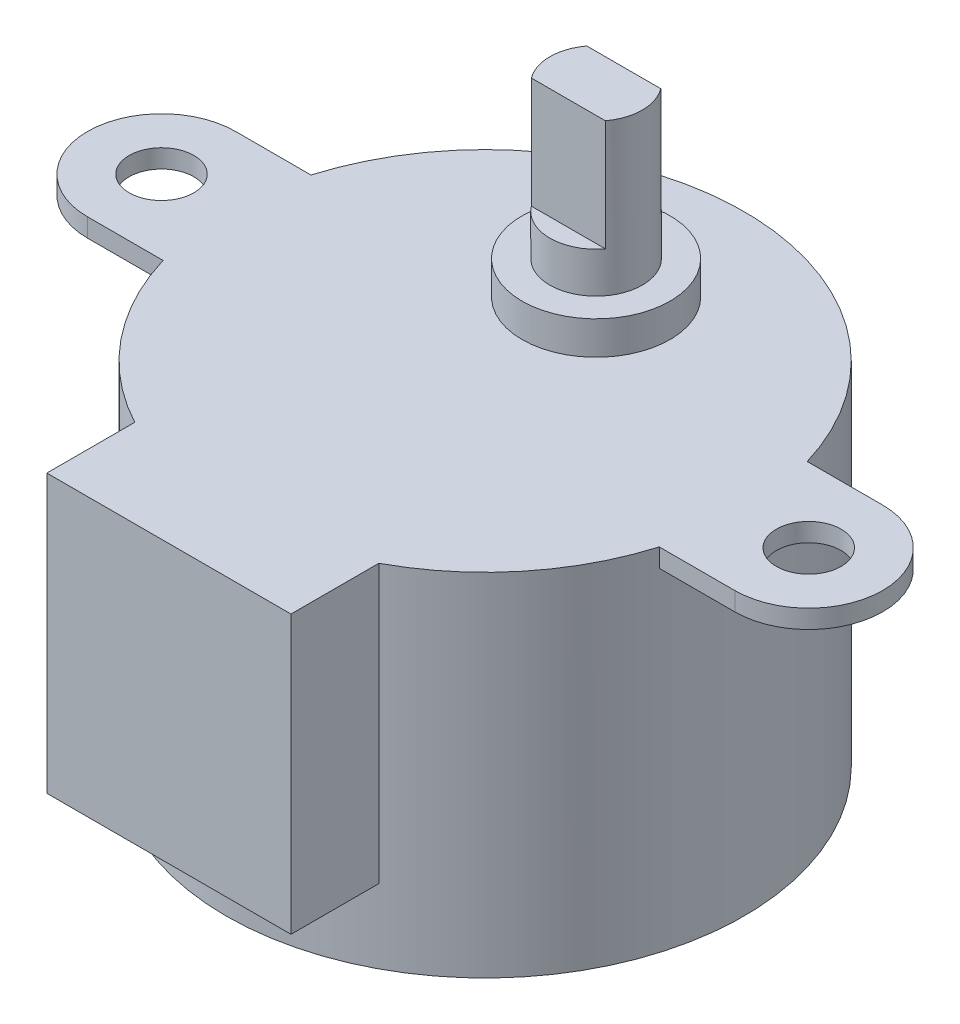
ISO-10303-21;
HEADER;
FILE_DESCRIPTION(('STEP AP214'),'2;1');
FILE_NAME('part.step','',(''),(''),'','','');
FILE_SCHEMA(('AUTOMOTIVE_DESIGN { 1 0 10303 214 1 1 1 1 }'));
ENDSEC;
DATA;
#1=APPLICATION_CONTEXT('core data for automotive mechanical design processes');
#2=APPLICATION_PROTOCOL_DEFINITION('international standard','automotive_design',2000,#1);
#3=PRODUCT_CONTEXT('',#1,'mechanical');
#4=PRODUCT('Part','Part','',(#3));
#5=PRODUCT_RELATED_PRODUCT_CATEGORY('part','',(#4));
#6=PRODUCT_DEFINITION_FORMATION('','',#4);
#7=PRODUCT_DEFINITION_CONTEXT('part definition',#1,'design');
#8=PRODUCT_DEFINITION('design','',#6,#7);
#9=PRODUCT_DEFINITION_SHAPE('','',#8);
#10=(LENGTH_UNIT() NAMED_UNIT(*) SI_UNIT(.MILLI.,.METRE.));
#11=(NAMED_UNIT(*) PLANE_ANGLE_UNIT() SI_UNIT($,.RADIAN.));
#12=(NAMED_UNIT(*) SI_UNIT($,.STERADIAN.) SOLID_ANGLE_UNIT());
#13=UNCERTAINTY_MEASURE_WITH_UNIT(LENGTH_MEASURE(1.E-05),#10,'distance_accuracy_value','');
#14=(GEOMETRIC_REPRESENTATION_CONTEXT(3) GLOBAL_UNCERTAINTY_ASSIGNED_CONTEXT((#13)) GLOBAL_UNIT_ASSIGNED_CONTEXT((#10,
#11,#12)) REPRESENTATION_CONTEXT('',''));
#15=CARTESIAN_POINT('',(0.,0.,0.));
#16=DIRECTION('',(0.,0.,1.));
#17=DIRECTION('',(1.,0.,0.));
#18=AXIS2_PLACEMENT_3D('',#15,#16,#17);
#19=CARTESIAN_POINT('',(0.,29.,-6.));
#20=DIRECTION('',(0.,-1.,0.));
#21=DIRECTION('',(0.,0.,-1.));
#22=AXIS2_PLACEMENT_3D('',#19,#20,#21);
#23=CYLINDRICAL_SURFACE('',#22,2.5);
#24=CARTESIAN_POINT('',(0.,29.,-6.));
#25=DIRECTION('',(0.,1.,0.));
#26=DIRECTION('',(0.,0.,1.));
#27=AXIS2_PLACEMENT_3D('',#24,#25,#26);
#28=CIRCLE('',#27,2.5);
#29=CARTESIAN_POINT('',(2.,29.,-4.5));
#30=VERTEX_POINT('',#29);
#31=CARTESIAN_POINT('',(2.,29.,-7.5));
#32=VERTEX_POINT('',#31);
#33=EDGE_CURVE('E172',#30,#32,#28,.T.);
#34=ORIENTED_EDGE('',*,*,#33,.F.);
#35=DIRECTION('',(0.,1.,0.));
#36=VECTOR('',#35,1.);
#37=CARTESIAN_POINT('',(2.,23.,-4.5));
#38=LINE('',#37,#36);
#39=CARTESIAN_POINT('',(2.,23.,-4.5));
#40=VERTEX_POINT('',#39);
#41=EDGE_CURVE('E65',#40,#30,#38,.T.);
#42=ORIENTED_EDGE('',*,*,#41,.F.);
#43=CARTESIAN_POINT('',(0.,23.,-6.));
#44=DIRECTION('',(0.,1.,0.));
#45=DIRECTION('',(0.,0.,1.));
#46=AXIS2_PLACEMENT_3D('',#43,#44,#45);
#47=CIRCLE('',#46,2.5);
#48=CARTESIAN_POINT('',(-2.,23.,-4.5));
#49=VERTEX_POINT('',#48);
#50=EDGE_CURVE('E156',#49,#40,#47,.T.);
#51=ORIENTED_EDGE('',*,*,#50,.F.);
#52=DIRECTION('',(0.,1.,0.));
#53=VECTOR('',#52,1.);
#54=CARTESIAN_POINT('',(-2.,23.,-4.5));
#55=LINE('',#54,#53);
#56=CARTESIAN_POINT('',(-2.,29.,-4.5));
#57=VERTEX_POINT('',#56);
#58=EDGE_CURVE('E165',#49,#57,#55,.T.);
#59=ORIENTED_EDGE('',*,*,#58,.T.);
#60=CARTESIAN_POINT('',(-2.,29.,-7.5));
#61=VERTEX_POINT('',#60);
#62=EDGE_CURVE('E176',#61,#57,#28,.T.);
#63=ORIENTED_EDGE('',*,*,#62,.F.);
#64=DIRECTION('',(0.,1.,0.));
#65=VECTOR('',#64,1.);
#66=CARTESIAN_POINT('',(-2.,23.,-7.5));
#67=LINE('',#66,#65);
#68=CARTESIAN_POINT('',(-2.,23.,-7.5));
#69=VERTEX_POINT('',#68);
#70=EDGE_CURVE('E57',#69,#61,#67,.T.);
#71=ORIENTED_EDGE('',*,*,#70,.F.);
#72=CARTESIAN_POINT('',(0.,23.,-6.));
#73=DIRECTION('',(0.,1.,0.));
#74=DIRECTION('',(0.,0.,1.));
#75=AXIS2_PLACEMENT_3D('',#72,#73,#74);
#76=CIRCLE('',#75,2.5);
#77=CARTESIAN_POINT('',(2.,23.,-7.5));
#78=VERTEX_POINT('',#77);
#79=EDGE_CURVE('E183',#78,#69,#76,.T.);
#80=ORIENTED_EDGE('',*,*,#79,.F.);
#81=DIRECTION('',(0.,1.,0.));
#82=VECTOR('',#81,1.);
#83=CARTESIAN_POINT('',(2.,23.,-7.5));
#84=LINE('',#83,#82);
#85=EDGE_CURVE('E188',#78,#32,#84,.T.);
#86=ORIENTED_EDGE('',*,*,#85,.T.);
#87=EDGE_LOOP('',(#34,#42,#51,#59,#63,#71,#80,#86));
#88=FACE_BOUND('',#87,.T.);
#89=CARTESIAN_POINT('',(0.,20.8,-6.));
#90=DIRECTION('',(0.,1.,0.));
#91=DIRECTION('',(0.,0.,1.));
#92=AXIS2_PLACEMENT_3D('',#89,#90,#91);
#93=CIRCLE('',#92,2.5);
#94=CARTESIAN_POINT('',(0.,20.8,-3.5));
#95=VERTEX_POINT('',#94);
#96=EDGE_CURVE('E11',#95,#95,#93,.T.);
#97=ORIENTED_EDGE('',*,*,#96,.T.);
#98=EDGE_LOOP('',(#97));
#99=FACE_BOUND('',#98,.T.);
#100=ADVANCED_FACE('F39',(#88,#99),#23,.T.);
#101=CARTESIAN_POINT('',(0.,29.,-6.));
#102=DIRECTION('',(0.,1.,0.));
#103=DIRECTION('',(0.,0.,1.));
#104=AXIS2_PLACEMENT_3D('',#101,#102,#103);
#105=PLANE('',#104);
#106=DIRECTION('',(-1.,0.,0.));
#107=VECTOR('',#106,1.);
#108=CARTESIAN_POINT('',(0.,29.,-4.5));
#109=LINE('',#108,#107);
#110=EDGE_CURVE('E162',#30,#57,#109,.T.);
#111=ORIENTED_EDGE('',*,*,#110,.F.);
#112=ORIENTED_EDGE('',*,*,#33,.T.);
#113=DIRECTION('',(-1.,0.,0.));
#114=VECTOR('',#113,1.);
#115=CARTESIAN_POINT('',(0.,29.,-7.5));
#116=LINE('',#115,#114);
#117=EDGE_CURVE('E184',#32,#61,#116,.T.);
#118=ORIENTED_EDGE('',*,*,#117,.T.);
#119=ORIENTED_EDGE('',*,*,#62,.T.);
#120=EDGE_LOOP('',(#111,#112,#118,#119));
#121=FACE_BOUND('',#120,.T.);
#122=ADVANCED_FACE('F399',(#121),#105,.T.);
#123=CARTESIAN_POINT('',(0.,19.,0.));
#124=DIRECTION('',(0.,-1.,0.));
#125=DIRECTION('',(0.,0.,-1.));
#126=AXIS2_PLACEMENT_3D('',#123,#124,#125);
#127=CYLINDRICAL_SURFACE('',#126,14.);
#128=CARTESIAN_POINT('',(0.,18.,0.));
#129=DIRECTION('',(0.,1.,0.));
#130=DIRECTION('',(0.,0.,1.));
#131=AXIS2_PLACEMENT_3D('',#128,#129,#130);
#132=CIRCLE('',#131,14.);
#133=CARTESIAN_POINT('',(13.4164078649987,18.,4.));
#134=VERTEX_POINT('',#133);
#135=CARTESIAN_POINT('',(13.4164078649987,18.,-4.00000000000001));
#136=VERTEX_POINT('',#135);
#137=EDGE_CURVE('E49',#134,#136,#132,.T.);
#138=ORIENTED_EDGE('',*,*,#137,.F.);
#139=DIRECTION('',(0.,-1.,0.));
#140=VECTOR('',#139,1.);
#141=CARTESIAN_POINT('',(13.4164078649987,19.,4.));
#142=LINE('',#141,#140);
#143=CARTESIAN_POINT('',(13.4164078649987,19.,4.));
#144=VERTEX_POINT('',#143);
#145=EDGE_CURVE('E277',#134,#144,#142,.F.);
#146=ORIENTED_EDGE('',*,*,#145,.T.);
#147=CARTESIAN_POINT('',(0.,19.,0.));
#148=DIRECTION('',(0.,1.,0.));
#149=DIRECTION('',(0.,0.,1.));
#150=AXIS2_PLACEMENT_3D('',#147,#148,#149);
#151=CIRCLE('',#150,14.);
#152=CARTESIAN_POINT('',(6.60138016649946,19.,12.3459215896322));
#153=VERTEX_POINT('',#152);
#154=EDGE_CURVE('E322',#153,#144,#151,.T.);
#155=ORIENTED_EDGE('',*,*,#154,.F.);
#156=DIRECTION('',(0.,-1.,0.));
#157=VECTOR('',#156,1.);
#158=CARTESIAN_POINT('',(6.60138016649946,19.,12.3459215896322));
#159=LINE('',#158,#157);
#160=CARTESIAN_POINT('',(6.60138016649946,4.,12.3459215896322));
#161=VERTEX_POINT('',#160);
#162=EDGE_CURVE('E310',#153,#161,#159,.T.);
#163=ORIENTED_EDGE('',*,*,#162,.T.);
#164=CARTESIAN_POINT('',(0.,4.,0.));
#165=DIRECTION('',(0.,1.,0.));
#166=DIRECTION('',(0.,0.,1.));
#167=AXIS2_PLACEMENT_3D('',#164,#165,#166);
#168=CIRCLE('',#167,14.);
#169=CARTESIAN_POINT('',(-6.60138016649946,4.,12.3459215896322));
#170=VERTEX_POINT('',#169);
#171=EDGE_CURVE('E326',#170,#161,#168,.T.);
#172=ORIENTED_EDGE('',*,*,#171,.F.);
#173=DIRECTION('',(0.,-1.,0.));
#174=VECTOR('',#173,1.);
#175=CARTESIAN_POINT('',(-6.60138016649946,19.,12.3459215896322));
#176=LINE('',#175,#174);
#177=CARTESIAN_POINT('',(-6.60138016649946,19.,12.3459215896322));
#178=VERTEX_POINT('',#177);
#179=EDGE_CURVE('E317',#170,#178,#176,.F.);
#180=ORIENTED_EDGE('',*,*,#179,.T.);
#181=CARTESIAN_POINT('',(-13.4164078649987,19.,4.));
#182=VERTEX_POINT('',#181);
#183=EDGE_CURVE('E328',#182,#178,#151,.T.);
#184=ORIENTED_EDGE('',*,*,#183,.F.);
#185=DIRECTION('',(0.,-1.,0.));
#186=VECTOR('',#185,1.);
#187=CARTESIAN_POINT('',(-13.4164078649987,19.,4.));
#188=LINE('',#187,#186);
#189=CARTESIAN_POINT('',(-13.4164078649987,18.,4.));
#190=VERTEX_POINT('',#189);
#191=EDGE_CURVE('E281',#182,#190,#188,.T.);
#192=ORIENTED_EDGE('',*,*,#191,.T.);
#193=CARTESIAN_POINT('',(-13.4164078649987,18.,-4.));
#194=VERTEX_POINT('',#193);
#195=EDGE_CURVE('E43',#194,#190,#132,.T.);
#196=ORIENTED_EDGE('',*,*,#195,.F.);
#197=DIRECTION('',(0.,-1.,0.));
#198=VECTOR('',#197,1.);
#199=CARTESIAN_POINT('',(-13.4164078649987,19.,-4.));
#200=LINE('',#199,#198);
#201=CARTESIAN_POINT('',(-13.4164078649987,19.,-4.));
#202=VERTEX_POINT('',#201);
#203=EDGE_CURVE('E260',#194,#202,#200,.F.);
#204=ORIENTED_EDGE('',*,*,#203,.T.);
#205=CARTESIAN_POINT('',(13.4164078649987,19.,-4.00000000000001));
#206=VERTEX_POINT('',#205);
#207=EDGE_CURVE('E327',#206,#202,#151,.T.);
#208=ORIENTED_EDGE('',*,*,#207,.F.);
#209=DIRECTION('',(0.,-1.,0.));
#210=VECTOR('',#209,1.);
#211=CARTESIAN_POINT('',(13.4164078649987,19.,-4.00000000000001));
#212=LINE('',#211,#210);
#213=EDGE_CURVE('E273',#206,#136,#212,.T.);
#214=ORIENTED_EDGE('',*,*,#213,.T.);
#215=EDGE_LOOP('',(#138,#146,#155,#163,#172,#180,#184,#192,#196,#204,#208,#214));
#216=FACE_BOUND('',#215,.T.);
#217=CARTESIAN_POINT('',(0.,0.,0.));
#218=DIRECTION('',(0.,1.,0.));
#219=DIRECTION('',(0.,0.,1.));
#220=AXIS2_PLACEMENT_3D('',#217,#218,#219);
#221=CIRCLE('',#220,14.);
#222=CARTESIAN_POINT('',(0.,0.,14.));
#223=VERTEX_POINT('',#222);
#224=EDGE_CURVE('E321',#223,#223,#221,.T.);
#225=ORIENTED_EDGE('',*,*,#224,.T.);
#226=EDGE_LOOP('',(#225));
#227=FACE_BOUND('',#226,.T.);
#228=ADVANCED_FACE('F41',(#216,#227),#127,.T.);
#229=CARTESIAN_POINT('',(0.,19.,0.));
#230=DIRECTION('',(0.,1.,0.));
#231=DIRECTION('',(0.,0.,1.));
#232=AXIS2_PLACEMENT_3D('',#229,#230,#231);
#233=PLANE('',#232);
#234=CARTESIAN_POINT('',(0.,19.,-6.));
#235=DIRECTION('',(0.,1.,0.));
#236=DIRECTION('',(0.,0.,1.));
#237=AXIS2_PLACEMENT_3D('',#234,#235,#236);
#238=CIRCLE('',#237,4.);
#239=CARTESIAN_POINT('',(0.,19.,-2.));
#240=VERTEX_POINT('',#239);
#241=EDGE_CURVE('E196',#240,#240,#238,.T.);
#242=ORIENTED_EDGE('',*,*,#241,.F.);
#243=EDGE_LOOP('',(#242));
#244=FACE_BOUND('',#243,.T.);
#245=ORIENTED_EDGE('',*,*,#207,.T.);
#246=DIRECTION('',(-1.,0.,0.));
#247=VECTOR('',#246,1.);
#248=CARTESIAN_POINT('',(17.5,19.,-4.00000000000001));
#249=LINE('',#248,#247);
#250=CARTESIAN_POINT('',(-17.5,19.,-4.));
#251=VERTEX_POINT('',#250);
#252=EDGE_CURVE('E245',#202,#251,#249,.T.);
#253=ORIENTED_EDGE('',*,*,#252,.T.);
#254=CARTESIAN_POINT('',(-17.5,19.,0.));
#255=DIRECTION('',(0.,1.,0.));
#256=DIRECTION('',(0.,0.,1.));
#257=AXIS2_PLACEMENT_3D('',#254,#255,#256);
#258=CIRCLE('',#257,4.);
#259=CARTESIAN_POINT('',(-17.5,19.,4.00000000000001));
#260=VERTEX_POINT('',#259);
#261=EDGE_CURVE('E249',#251,#260,#258,.T.);
#262=ORIENTED_EDGE('',*,*,#261,.T.);
#263=DIRECTION('',(1.,0.,0.));
#264=VECTOR('',#263,1.);
#265=CARTESIAN_POINT('',(17.5,19.,3.99999999999999));
#266=LINE('',#265,#264);
#267=EDGE_CURVE('E227',#260,#182,#266,.T.);
#268=ORIENTED_EDGE('',*,*,#267,.T.);
#269=ORIENTED_EDGE('',*,*,#183,.T.);
#270=DIRECTION('',(0.,0.,1.));
#271=VECTOR('',#270,1.);
#272=CARTESIAN_POINT('',(-6.60138016649946,19.,17.1));
#273=LINE('',#272,#271);
#274=CARTESIAN_POINT('',(-6.60138016649946,19.,17.1));
#275=VERTEX_POINT('',#274);
#276=EDGE_CURVE('E285',#178,#275,#273,.T.);
#277=ORIENTED_EDGE('',*,*,#276,.T.);
#278=DIRECTION('',(1.,0.,0.));
#279=VECTOR('',#278,1.);
#280=CARTESIAN_POINT('',(6.60138016649946,19.,17.1));
#281=LINE('',#280,#279);
#282=CARTESIAN_POINT('',(6.60138016649946,19.,17.1));
#283=VERTEX_POINT('',#282);
#284=EDGE_CURVE('E301',#275,#283,#281,.T.);
#285=ORIENTED_EDGE('',*,*,#284,.T.);
#286=DIRECTION('',(0.,0.,-1.));
#287=VECTOR('',#286,1.);
#288=CARTESIAN_POINT('',(6.60138016649946,19.,17.1));
#289=LINE('',#288,#287);
#290=EDGE_CURVE('E290',#283,#153,#289,.T.);
#291=ORIENTED_EDGE('',*,*,#290,.T.);
#292=ORIENTED_EDGE('',*,*,#154,.T.);
#293=CARTESIAN_POINT('',(17.5,19.,3.99999999999999));
#294=VERTEX_POINT('',#293);
#295=EDGE_CURVE('E253',#144,#294,#266,.T.);
#296=ORIENTED_EDGE('',*,*,#295,.T.);
#297=CARTESIAN_POINT('',(17.5,19.,0.));
#298=DIRECTION('',(0.,1.,0.));
#299=DIRECTION('',(0.,0.,1.));
#300=AXIS2_PLACEMENT_3D('',#297,#298,#299);
#301=CIRCLE('',#300,4.);
#302=CARTESIAN_POINT('',(17.5,19.,-4.00000000000001));
#303=VERTEX_POINT('',#302);
#304=EDGE_CURVE('E218',#294,#303,#301,.T.);
#305=ORIENTED_EDGE('',*,*,#304,.T.);
#306=EDGE_CURVE('E246',#303,#206,#249,.T.);
#307=ORIENTED_EDGE('',*,*,#306,.T.);
#308=EDGE_LOOP('',(#245,#253,#262,#268,#269,#277,#285,#291,#292,#296,#305,#307));
#309=FACE_BOUND('',#308,.T.);
#310=CARTESIAN_POINT('',(-17.5,19.,0.));
#311=DIRECTION('',(0.,1.,0.));
#312=DIRECTION('',(0.,0.,1.));
#313=AXIS2_PLACEMENT_3D('',#310,#311,#312);
#314=CIRCLE('',#313,1.75);
#315=CARTESIAN_POINT('',(-17.5,19.,1.75));
#316=VERTEX_POINT('',#315);
#317=EDGE_CURVE('E210',#316,#316,#314,.T.);
#318=ORIENTED_EDGE('',*,*,#317,.F.);
#319=EDGE_LOOP('',(#318));
#320=FACE_BOUND('',#319,.T.);
#321=CARTESIAN_POINT('',(17.5,19.,0.));
#322=DIRECTION('',(0.,1.,0.));
#323=DIRECTION('',(0.,0.,1.));
#324=AXIS2_PLACEMENT_3D('',#321,#322,#323);
#325=CIRCLE('',#324,1.75);
#326=CARTESIAN_POINT('',(17.5,19.,1.74999999999999));
#327=VERTEX_POINT('',#326);
#328=EDGE_CURVE('E202',#327,#327,#325,.T.);
#329=ORIENTED_EDGE('',*,*,#328,.F.);
#330=EDGE_LOOP('',(#329));
#331=FACE_BOUND('',#330,.T.);
#332=ADVANCED_FACE('F361',(#244,#309,#320,#331),#233,.T.);
#333=CARTESIAN_POINT('',(0.,0.,0.));
#334=DIRECTION('',(0.,1.,0.));
#335=DIRECTION('',(0.,0.,1.));
#336=AXIS2_PLACEMENT_3D('',#333,#334,#335);
#337=PLANE('',#336);
#338=ORIENTED_EDGE('',*,*,#224,.F.);
#339=EDGE_LOOP('',(#338));
#340=FACE_BOUND('',#339,.T.);
#341=ADVANCED_FACE('F502',(#340),#337,.F.);
#342=CARTESIAN_POINT('',(-6.60138016649946,4.,17.1));
#343=DIRECTION('',(-1.,0.,0.));
#344=DIRECTION('',(0.,0.,1.));
#345=AXIS2_PLACEMENT_3D('',#342,#343,#344);
#346=PLANE('',#345);
#347=ORIENTED_EDGE('',*,*,#179,.F.);
#348=DIRECTION('',(0.,0.,1.));
#349=VECTOR('',#348,1.);
#350=CARTESIAN_POINT('',(-6.60138016649946,4.,17.1));
#351=LINE('',#350,#349);
#352=CARTESIAN_POINT('',(-6.60138016649946,4.,17.1));
#353=VERTEX_POINT('',#352);
#354=EDGE_CURVE('E286',#170,#353,#351,.T.);
#355=ORIENTED_EDGE('',*,*,#354,.T.);
#356=DIRECTION('',(0.,1.,0.));
#357=VECTOR('',#356,1.);
#358=CARTESIAN_POINT('',(-6.60138016649946,4.,17.1));
#359=LINE('',#358,#357);
#360=EDGE_CURVE('E298',#353,#275,#359,.T.);
#361=ORIENTED_EDGE('',*,*,#360,.T.);
#362=ORIENTED_EDGE('',*,*,#276,.F.);
#363=EDGE_LOOP('',(#347,#355,#361,#362));
#364=FACE_BOUND('',#363,.T.);
#365=ADVANCED_FACE('F366',(#364),#346,.T.);
#366=CARTESIAN_POINT('',(6.60138016649946,4.,17.1));
#367=DIRECTION('',(1.,0.,0.));
#368=DIRECTION('',(0.,0.,-1.));
#369=AXIS2_PLACEMENT_3D('',#366,#367,#368);
#370=PLANE('',#369);
#371=ORIENTED_EDGE('',*,*,#162,.F.);
#372=ORIENTED_EDGE('',*,*,#290,.F.);
#373=DIRECTION('',(0.,1.,0.));
#374=VECTOR('',#373,1.);
#375=CARTESIAN_POINT('',(6.60138016649946,4.,17.1));
#376=LINE('',#375,#374);
#377=CARTESIAN_POINT('',(6.60138016649946,4.,17.1));
#378=VERTEX_POINT('',#377);
#379=EDGE_CURVE('E307',#378,#283,#376,.T.);
#380=ORIENTED_EDGE('',*,*,#379,.F.);
#381=DIRECTION('',(0.,0.,-1.));
#382=VECTOR('',#381,1.);
#383=CARTESIAN_POINT('',(6.60138016649946,4.,17.1));
#384=LINE('',#383,#382);
#385=EDGE_CURVE('E294',#378,#161,#384,.T.);
#386=ORIENTED_EDGE('',*,*,#385,.T.);
#387=EDGE_LOOP('',(#371,#372,#380,#386));
#388=FACE_BOUND('',#387,.T.);
#389=ADVANCED_FACE('F373',(#388),#370,.T.);
#390=CARTESIAN_POINT('',(6.60138016649946,4.,17.1));
#391=DIRECTION('',(0.,0.,1.));
#392=DIRECTION('',(1.,0.,0.));
#393=AXIS2_PLACEMENT_3D('',#390,#391,#392);
#394=PLANE('',#393);
#395=ORIENTED_EDGE('',*,*,#284,.F.);
#396=ORIENTED_EDGE('',*,*,#360,.F.);
#397=DIRECTION('',(1.,0.,0.));
#398=VECTOR('',#397,1.);
#399=CARTESIAN_POINT('',(6.60138016649946,4.,17.1));
#400=LINE('',#399,#398);
#401=EDGE_CURVE('E289',#353,#378,#400,.T.);
#402=ORIENTED_EDGE('',*,*,#401,.T.);
#403=ORIENTED_EDGE('',*,*,#379,.T.);
#404=EDGE_LOOP('',(#395,#396,#402,#403));
#405=FACE_BOUND('',#404,.T.);
#406=ADVANCED_FACE('F377',(#405),#394,.T.);
#407=CARTESIAN_POINT('',(0.,4.,0.));
#408=DIRECTION('',(0.,1.,0.));
#409=DIRECTION('',(0.,0.,1.));
#410=AXIS2_PLACEMENT_3D('',#407,#408,#409);
#411=PLANE('',#410);
#412=ORIENTED_EDGE('',*,*,#354,.F.);
#413=ORIENTED_EDGE('',*,*,#171,.T.);
#414=ORIENTED_EDGE('',*,*,#385,.F.);
#415=ORIENTED_EDGE('',*,*,#401,.F.);
#416=EDGE_LOOP('',(#412,#413,#414,#415));
#417=FACE_BOUND('',#416,.T.);
#418=ADVANCED_FACE('F375',(#417),#411,.F.);
#419=CARTESIAN_POINT('',(-17.5,18.,0.));
#420=DIRECTION('',(0.,1.,0.));
#421=DIRECTION('',(0.,0.,1.));
#422=AXIS2_PLACEMENT_3D('',#419,#420,#421);
#423=CYLINDRICAL_SURFACE('',#422,1.75);
#424=CARTESIAN_POINT('',(-17.5,18.,0.));
#425=DIRECTION('',(0.,1.,0.));
#426=DIRECTION('',(0.,0.,1.));
#427=AXIS2_PLACEMENT_3D('',#424,#425,#426);
#428=CIRCLE('',#427,1.75);
#429=CARTESIAN_POINT('',(-17.5,18.,1.75));
#430=VERTEX_POINT('',#429);
#431=EDGE_CURVE('E214',#430,#430,#428,.T.);
#432=ORIENTED_EDGE('',*,*,#431,.F.);
#433=EDGE_LOOP('',(#432));
#434=FACE_BOUND('',#433,.T.);
#435=ORIENTED_EDGE('',*,*,#317,.T.);
#436=EDGE_LOOP('',(#435));
#437=FACE_BOUND('',#436,.T.);
#438=ADVANCED_FACE('F416',(#434,#437),#423,.F.);
#439=CARTESIAN_POINT('',(-17.5,18.,0.));
#440=DIRECTION('',(0.,1.,0.));
#441=DIRECTION('',(0.,0.,1.));
#442=AXIS2_PLACEMENT_3D('',#439,#440,#441);
#443=CYLINDRICAL_SURFACE('',#442,4.);
#444=ORIENTED_EDGE('',*,*,#261,.F.);
#445=DIRECTION('',(0.,1.,0.));
#446=VECTOR('',#445,1.);
#447=CARTESIAN_POINT('',(-17.5,18.,-4.));
#448=LINE('',#447,#446);
#449=CARTESIAN_POINT('',(-17.5,18.,-4.));
#450=VERTEX_POINT('',#449);
#451=EDGE_CURVE('E264',#450,#251,#448,.T.);
#452=ORIENTED_EDGE('',*,*,#451,.F.);
#453=CARTESIAN_POINT('',(-17.5,18.,0.));
#454=DIRECTION('',(0.,1.,0.));
#455=DIRECTION('',(0.,0.,1.));
#456=AXIS2_PLACEMENT_3D('',#453,#454,#455);
#457=CIRCLE('',#456,4.);
#458=CARTESIAN_POINT('',(-17.5,18.,4.00000000000001));
#459=VERTEX_POINT('',#458);
#460=EDGE_CURVE('E232',#450,#459,#457,.T.);
#461=ORIENTED_EDGE('',*,*,#460,.T.);
#462=DIRECTION('',(0.,1.,0.));
#463=VECTOR('',#462,1.);
#464=CARTESIAN_POINT('',(-17.5,18.,4.00000000000001));
#465=LINE('',#464,#463);
#466=EDGE_CURVE('E261',#459,#260,#465,.T.);
#467=ORIENTED_EDGE('',*,*,#466,.T.);
#468=EDGE_LOOP('',(#444,#452,#461,#467));
#469=FACE_BOUND('',#468,.T.);
#470=ADVANCED_FACE('F419',(#469),#443,.T.);
#471=CARTESIAN_POINT('',(17.5,18.,0.));
#472=DIRECTION('',(0.,1.,0.));
#473=DIRECTION('',(0.,0.,1.));
#474=AXIS2_PLACEMENT_3D('',#471,#472,#473);
#475=PLANE('',#474);
#476=ORIENTED_EDGE('',*,*,#431,.T.);
#477=EDGE_LOOP('',(#476));
#478=FACE_BOUND('',#477,.T.);
#479=DIRECTION('',(-1.,0.,0.));
#480=VECTOR('',#479,1.);
#481=CARTESIAN_POINT('',(17.5,18.,-4.00000000000001));
#482=LINE('',#481,#480);
#483=EDGE_CURVE('E226',#194,#450,#482,.T.);
#484=ORIENTED_EDGE('',*,*,#483,.F.);
#485=ORIENTED_EDGE('',*,*,#195,.T.);
#486=DIRECTION('',(1.,0.,0.));
#487=VECTOR('',#486,1.);
#488=CARTESIAN_POINT('',(17.5,18.,3.99999999999999));
#489=LINE('',#488,#487);
#490=EDGE_CURVE('E237',#459,#190,#489,.T.);
#491=ORIENTED_EDGE('',*,*,#490,.F.);
#492=ORIENTED_EDGE('',*,*,#460,.F.);
#493=EDGE_LOOP('',(#484,#485,#491,#492));
#494=FACE_BOUND('',#493,.T.);
#495=ADVANCED_FACE('F421',(#478,#494),#475,.F.);
#496=CARTESIAN_POINT('',(17.5,18.,-4.00000000000001));
#497=DIRECTION('',(0.,0.,-1.));
#498=DIRECTION('',(-1.,0.,0.));
#499=AXIS2_PLACEMENT_3D('',#496,#497,#498);
#500=PLANE('',#499);
#501=ORIENTED_EDGE('',*,*,#203,.F.);
#502=ORIENTED_EDGE('',*,*,#483,.T.);
#503=ORIENTED_EDGE('',*,*,#451,.T.);
#504=ORIENTED_EDGE('',*,*,#252,.F.);
#505=EDGE_LOOP('',(#501,#502,#503,#504));
#506=FACE_BOUND('',#505,.T.);
#507=ADVANCED_FACE('F396',(#506),#500,.T.);
#508=CARTESIAN_POINT('',(17.5,18.,3.99999999999999));
#509=DIRECTION('',(0.,0.,1.));
#510=DIRECTION('',(1.,0.,0.));
#511=AXIS2_PLACEMENT_3D('',#508,#509,#510);
#512=PLANE('',#511);
#513=ORIENTED_EDGE('',*,*,#191,.F.);
#514=ORIENTED_EDGE('',*,*,#267,.F.);
#515=ORIENTED_EDGE('',*,*,#466,.F.);
#516=ORIENTED_EDGE('',*,*,#490,.T.);
#517=EDGE_LOOP('',(#513,#514,#515,#516));
#518=FACE_BOUND('',#517,.T.);
#519=ADVANCED_FACE('F425',(#518),#512,.T.);
#520=CARTESIAN_POINT('',(17.5,18.,0.));
#521=DIRECTION('',(0.,1.,0.));
#522=DIRECTION('',(0.,0.,1.));
#523=AXIS2_PLACEMENT_3D('',#520,#521,#522);
#524=CIRCLE('',#523,1.75);
#525=CARTESIAN_POINT('',(17.5,18.,1.74999999999999));
#526=VERTEX_POINT('',#525);
#527=EDGE_CURVE('E206',#526,#526,#524,.T.);
#528=ORIENTED_EDGE('',*,*,#527,.T.);
#529=EDGE_LOOP('',(#528));
#530=FACE_BOUND('',#529,.T.);
#531=CARTESIAN_POINT('',(17.5,18.,3.99999999999999));
#532=VERTEX_POINT('',#531);
#533=EDGE_CURVE('E236',#134,#532,#489,.T.);
#534=ORIENTED_EDGE('',*,*,#533,.F.);
#535=ORIENTED_EDGE('',*,*,#137,.T.);
#536=CARTESIAN_POINT('',(17.5,18.,-4.00000000000001));
#537=VERTEX_POINT('',#536);
#538=EDGE_CURVE('E228',#537,#136,#482,.T.);
#539=ORIENTED_EDGE('',*,*,#538,.F.);
#540=CARTESIAN_POINT('',(17.5,18.,0.));
#541=DIRECTION('',(0.,1.,0.));
#542=DIRECTION('',(0.,0.,1.));
#543=AXIS2_PLACEMENT_3D('',#540,#541,#542);
#544=CIRCLE('',#543,4.);
#545=EDGE_CURVE('E222',#532,#537,#544,.T.);
#546=ORIENTED_EDGE('',*,*,#545,.F.);
#547=EDGE_LOOP('',(#534,#535,#539,#546));
#548=FACE_BOUND('',#547,.T.);
#549=ADVANCED_FACE('F346',(#530,#548),#475,.F.);
#550=ORIENTED_EDGE('',*,*,#145,.F.);
#551=ORIENTED_EDGE('',*,*,#533,.T.);
#552=DIRECTION('',(0.,1.,0.));
#553=VECTOR('',#552,1.);
#554=CARTESIAN_POINT('',(17.5,18.,3.99999999999999));
#555=LINE('',#554,#553);
#556=EDGE_CURVE('E256',#532,#294,#555,.T.);
#557=ORIENTED_EDGE('',*,*,#556,.T.);
#558=ORIENTED_EDGE('',*,*,#295,.F.);
#559=EDGE_LOOP('',(#550,#551,#557,#558));
#560=FACE_BOUND('',#559,.T.);
#561=ADVANCED_FACE('F382',(#560),#512,.T.);
#562=ORIENTED_EDGE('',*,*,#213,.F.);
#563=ORIENTED_EDGE('',*,*,#306,.F.);
#564=DIRECTION('',(0.,1.,0.));
#565=VECTOR('',#564,1.);
#566=CARTESIAN_POINT('',(17.5,18.,-4.00000000000001));
#567=LINE('',#566,#565);
#568=EDGE_CURVE('E241',#537,#303,#567,.T.);
#569=ORIENTED_EDGE('',*,*,#568,.F.);
#570=ORIENTED_EDGE('',*,*,#538,.T.);
#571=EDGE_LOOP('',(#562,#563,#569,#570));
#572=FACE_BOUND('',#571,.T.);
#573=ADVANCED_FACE('F351',(#572),#500,.T.);
#574=CARTESIAN_POINT('',(17.5,18.,0.));
#575=DIRECTION('',(0.,1.,0.));
#576=DIRECTION('',(0.,0.,1.));
#577=AXIS2_PLACEMENT_3D('',#574,#575,#576);
#578=CYLINDRICAL_SURFACE('',#577,4.);
#579=ORIENTED_EDGE('',*,*,#304,.F.);
#580=ORIENTED_EDGE('',*,*,#556,.F.);
#581=ORIENTED_EDGE('',*,*,#545,.T.);
#582=ORIENTED_EDGE('',*,*,#568,.T.);
#583=EDGE_LOOP('',(#579,#580,#581,#582));
#584=FACE_BOUND('',#583,.T.);
#585=ADVANCED_FACE('F384',(#584),#578,.T.);
#586=CARTESIAN_POINT('',(17.5,18.,0.));
#587=DIRECTION('',(0.,1.,0.));
#588=DIRECTION('',(0.,0.,1.));
#589=AXIS2_PLACEMENT_3D('',#586,#587,#588);
#590=CYLINDRICAL_SURFACE('',#589,1.75);
#591=ORIENTED_EDGE('',*,*,#527,.F.);
#592=EDGE_LOOP('',(#591));
#593=FACE_BOUND('',#592,.T.);
#594=ORIENTED_EDGE('',*,*,#328,.T.);
#595=EDGE_LOOP('',(#594));
#596=FACE_BOUND('',#595,.T.);
#597=ADVANCED_FACE('F386',(#593,#596),#590,.F.);
#598=CARTESIAN_POINT('',(0.,20.8,-6.));
#599=DIRECTION('',(0.,-1.,0.));
#600=DIRECTION('',(0.,0.,-1.));
#601=AXIS2_PLACEMENT_3D('',#598,#599,#600);
#602=CYLINDRICAL_SURFACE('',#601,4.);
#603=CARTESIAN_POINT('',(0.,20.8,-6.));
#604=DIRECTION('',(0.,1.,0.));
#605=DIRECTION('',(0.,0.,1.));
#606=AXIS2_PLACEMENT_3D('',#603,#604,#605);
#607=CIRCLE('',#606,4.);
#608=CARTESIAN_POINT('',(0.,20.8,-2.));
#609=VERTEX_POINT('',#608);
#610=EDGE_CURVE('E198',#609,#609,#607,.T.);
#611=ORIENTED_EDGE('',*,*,#610,.F.);
#612=EDGE_LOOP('',(#611));
#613=FACE_BOUND('',#612,.T.);
#614=ORIENTED_EDGE('',*,*,#241,.T.);
#615=EDGE_LOOP('',(#614));
#616=FACE_BOUND('',#615,.T.);
#617=ADVANCED_FACE('F392',(#613,#616),#602,.T.);
#618=CARTESIAN_POINT('',(0.,20.8,-6.));
#619=DIRECTION('',(0.,1.,0.));
#620=DIRECTION('',(0.,0.,1.));
#621=AXIS2_PLACEMENT_3D('',#618,#619,#620);
#622=PLANE('',#621);
#623=ORIENTED_EDGE('',*,*,#96,.F.);
#624=EDGE_LOOP('',(#623));
#625=FACE_BOUND('',#624,.T.);
#626=ORIENTED_EDGE('',*,*,#610,.T.);
#627=EDGE_LOOP('',(#626));
#628=FACE_BOUND('',#627,.T.);
#629=ADVANCED_FACE('F408',(#625,#628),#622,.T.);
#630=CARTESIAN_POINT('',(0.,23.,-7.5));
#631=DIRECTION('',(0.,0.,-1.));
#632=DIRECTION('',(-1.,0.,0.));
#633=AXIS2_PLACEMENT_3D('',#630,#631,#632);
#634=PLANE('',#633);
#635=ORIENTED_EDGE('',*,*,#117,.F.);
#636=ORIENTED_EDGE('',*,*,#85,.F.);
#637=DIRECTION('',(-1.,0.,0.));
#638=VECTOR('',#637,1.);
#639=CARTESIAN_POINT('',(0.,23.,-7.5));
#640=LINE('',#639,#638);
#641=EDGE_CURVE('E180',#78,#69,#640,.T.);
#642=ORIENTED_EDGE('',*,*,#641,.T.);
#643=ORIENTED_EDGE('',*,*,#70,.T.);
#644=EDGE_LOOP('',(#635,#636,#642,#643));
#645=FACE_BOUND('',#644,.T.);
#646=ADVANCED_FACE('F411',(#645),#634,.T.);
#647=CARTESIAN_POINT('',(0.,23.,0.));
#648=DIRECTION('',(0.,1.,0.));
#649=DIRECTION('',(0.,0.,1.));
#650=AXIS2_PLACEMENT_3D('',#647,#648,#649);
#651=PLANE('',#650);
#652=ORIENTED_EDGE('',*,*,#641,.F.);
#653=ORIENTED_EDGE('',*,*,#79,.T.);
#654=EDGE_LOOP('',(#652,#653));
#655=FACE_BOUND('',#654,.T.);
#656=ADVANCED_FACE('F445',(#655),#651,.T.);
#657=CARTESIAN_POINT('',(0.,23.,-4.5));
#658=DIRECTION('',(0.,0.,-1.));
#659=DIRECTION('',(-1.,0.,0.));
#660=AXIS2_PLACEMENT_3D('',#657,#658,#659);
#661=PLANE('',#660);
#662=ORIENTED_EDGE('',*,*,#110,.T.);
#663=ORIENTED_EDGE('',*,*,#58,.F.);
#664=DIRECTION('',(-1.,0.,0.));
#665=VECTOR('',#664,1.);
#666=CARTESIAN_POINT('',(0.,23.,-4.5));
#667=LINE('',#666,#665);
#668=EDGE_CURVE('E158',#40,#49,#667,.T.);
#669=ORIENTED_EDGE('',*,*,#668,.F.);
#670=ORIENTED_EDGE('',*,*,#41,.T.);
#671=EDGE_LOOP('',(#662,#663,#669,#670));
#672=FACE_BOUND('',#671,.T.);
#673=ADVANCED_FACE('F164',(#672),#661,.F.);
#674=CARTESIAN_POINT('',(0.,23.,0.));
#675=DIRECTION('',(0.,1.,0.));
#676=DIRECTION('',(0.,0.,1.));
#677=AXIS2_PLACEMENT_3D('',#674,#675,#676);
#678=PLANE('',#677);
#679=ORIENTED_EDGE('',*,*,#50,.T.);
#680=ORIENTED_EDGE('',*,*,#668,.T.);
#681=EDGE_LOOP('',(#679,#680));
#682=FACE_BOUND('',#681,.T.);
#683=ADVANCED_FACE('F157',(#682),#678,.T.);
#684=CLOSED_SHELL('',(#100,#122,#228,#332,#341,#365,#389,#406,#418,#438,#470,#495,#507,#519,
#549,#561,#573,#585,#597,#617,#629,#646,#656,#673,#683));
#685=MANIFOLD_SOLID_BREP('B2',#684);
#686=ADVANCED_BREP_SHAPE_REPRESENTATION('',(#18,#685),#14);
#687=SHAPE_DEFINITION_REPRESENTATION(#9,#686);
ENDSEC;
END-ISO-10303-21;
